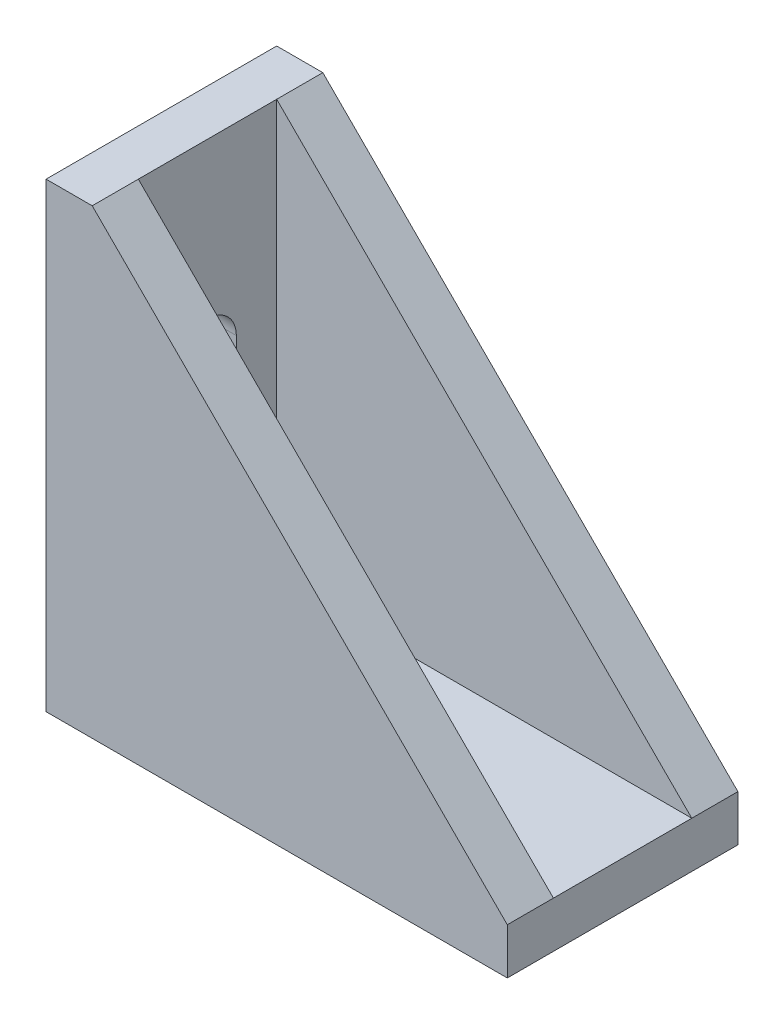
ISO-10303-21;
HEADER;
FILE_DESCRIPTION(('STEP AP214'),'2;1');
FILE_NAME('part.step','',(''),(''),'','','');
FILE_SCHEMA(('AUTOMOTIVE_DESIGN { 1 0 10303 214 1 1 1 1 }'));
ENDSEC;
DATA;
#1=APPLICATION_CONTEXT('core data for automotive mechanical design processes');
#2=APPLICATION_PROTOCOL_DEFINITION('international standard','automotive_design',2000,#1);
#3=PRODUCT_CONTEXT('',#1,'mechanical');
#4=PRODUCT('Part','Part','',(#3));
#5=PRODUCT_RELATED_PRODUCT_CATEGORY('part','',(#4));
#6=PRODUCT_DEFINITION_FORMATION('','',#4);
#7=PRODUCT_DEFINITION_CONTEXT('part definition',#1,'design');
#8=PRODUCT_DEFINITION('design','',#6,#7);
#9=PRODUCT_DEFINITION_SHAPE('','',#8);
#10=(LENGTH_UNIT() NAMED_UNIT(*) SI_UNIT(.MILLI.,.METRE.));
#11=(NAMED_UNIT(*) PLANE_ANGLE_UNIT() SI_UNIT($,.RADIAN.));
#12=(NAMED_UNIT(*) SI_UNIT($,.STERADIAN.) SOLID_ANGLE_UNIT());
#13=UNCERTAINTY_MEASURE_WITH_UNIT(LENGTH_MEASURE(1.E-05),#10,'distance_accuracy_value','');
#14=(GEOMETRIC_REPRESENTATION_CONTEXT(3) GLOBAL_UNCERTAINTY_ASSIGNED_CONTEXT((#13)) GLOBAL_UNIT_ASSIGNED_CONTEXT((#10,
#11,#12)) REPRESENTATION_CONTEXT('',''));
#15=CARTESIAN_POINT('',(0.,0.,0.));
#16=DIRECTION('',(0.,0.,1.));
#17=DIRECTION('',(1.,0.,0.));
#18=AXIS2_PLACEMENT_3D('',#15,#16,#17);
#19=CARTESIAN_POINT('',(20.,4.,-10.));
#20=DIRECTION('',(-1.,0.,0.));
#21=DIRECTION('',(0.,0.,1.));
#22=AXIS2_PLACEMENT_3D('',#19,#20,#21);
#23=PLANE('',#22);
#24=DIRECTION('',(0.,0.,-1.));
#25=VECTOR('',#24,1.);
#26=CARTESIAN_POINT('',(20.,0.,-10.));
#27=LINE('',#26,#25);
#28=CARTESIAN_POINT('',(20.,0.,10.));
#29=VERTEX_POINT('',#28);
#30=CARTESIAN_POINT('',(20.,0.,-10.));
#31=VERTEX_POINT('',#30);
#32=EDGE_CURVE('E253',#29,#31,#27,.T.);
#33=ORIENTED_EDGE('',*,*,#32,.T.);
#34=DIRECTION('',(0.,-1.,0.));
#35=VECTOR('',#34,1.);
#36=CARTESIAN_POINT('',(20.,4.,-10.));
#37=LINE('',#36,#35);
#38=CARTESIAN_POINT('',(20.,4.,-10.));
#39=VERTEX_POINT('',#38);
#40=EDGE_CURVE('E273',#39,#31,#37,.T.);
#41=ORIENTED_EDGE('',*,*,#40,.F.);
#42=DIRECTION('',(0.,0.,-1.));
#43=VECTOR('',#42,1.);
#44=CARTESIAN_POINT('',(20.,4.,-6.));
#45=LINE('',#44,#43);
#46=CARTESIAN_POINT('',(20.,4.,-6.));
#47=VERTEX_POINT('',#46);
#48=EDGE_CURVE('E225',#47,#39,#45,.T.);
#49=ORIENTED_EDGE('',*,*,#48,.F.);
#50=DIRECTION('',(0.,0.,-1.));
#51=VECTOR('',#50,1.);
#52=CARTESIAN_POINT('',(20.,4.,-10.));
#53=LINE('',#52,#51);
#54=CARTESIAN_POINT('',(20.,4.,6.));
#55=VERTEX_POINT('',#54);
#56=EDGE_CURVE('E257',#55,#47,#53,.T.);
#57=ORIENTED_EDGE('',*,*,#56,.F.);
#58=CARTESIAN_POINT('',(20.,4.,10.));
#59=VERTEX_POINT('',#58);
#60=EDGE_CURVE('E254',#59,#55,#53,.T.);
#61=ORIENTED_EDGE('',*,*,#60,.F.);
#62=DIRECTION('',(0.,-1.,0.));
#63=VECTOR('',#62,1.);
#64=CARTESIAN_POINT('',(20.,4.,10.));
#65=LINE('',#64,#63);
#66=EDGE_CURVE('E256',#59,#29,#65,.T.);
#67=ORIENTED_EDGE('',*,*,#66,.T.);
#68=EDGE_LOOP('',(#33,#41,#49,#57,#61,#67));
#69=FACE_BOUND('',#68,.T.);
#70=ADVANCED_FACE('F41',(#69),#23,.F.);
#71=CARTESIAN_POINT('',(-20.,4.,-10.));
#72=DIRECTION('',(0.,0.,1.));
#73=DIRECTION('',(1.,0.,0.));
#74=AXIS2_PLACEMENT_3D('',#71,#72,#73);
#75=PLANE('',#74);
#76=DIRECTION('',(-1.,0.,0.));
#77=VECTOR('',#76,1.);
#78=CARTESIAN_POINT('',(-20.,0.,-10.));
#79=LINE('',#78,#77);
#80=CARTESIAN_POINT('',(-20.,0.,-10.));
#81=VERTEX_POINT('',#80);
#82=EDGE_CURVE('E259',#31,#81,#79,.T.);
#83=ORIENTED_EDGE('',*,*,#82,.T.);
#84=DIRECTION('',(0.,-1.,0.));
#85=VECTOR('',#84,1.);
#86=CARTESIAN_POINT('',(-20.,4.,-10.));
#87=LINE('',#86,#85);
#88=CARTESIAN_POINT('',(-20.,40.,-10.));
#89=VERTEX_POINT('',#88);
#90=EDGE_CURVE('E270',#89,#81,#87,.T.);
#91=ORIENTED_EDGE('',*,*,#90,.F.);
#92=DIRECTION('',(-1.,0.,0.));
#93=VECTOR('',#92,1.);
#94=CARTESIAN_POINT('',(-16.,40.,-10.));
#95=LINE('',#94,#93);
#96=CARTESIAN_POINT('',(-16.,40.,-10.));
#97=VERTEX_POINT('',#96);
#98=EDGE_CURVE('E245',#97,#89,#95,.T.);
#99=ORIENTED_EDGE('',*,*,#98,.F.);
#100=DIRECTION('',(-0.707106781186547,0.707106781186547,0.));
#101=VECTOR('',#100,1.);
#102=CARTESIAN_POINT('',(-16.,40.,-10.));
#103=LINE('',#102,#101);
#104=EDGE_CURVE('E214',#39,#97,#103,.T.);
#105=ORIENTED_EDGE('',*,*,#104,.F.);
#106=ORIENTED_EDGE('',*,*,#40,.T.);
#107=EDGE_LOOP('',(#83,#91,#99,#105,#106));
#108=FACE_BOUND('',#107,.T.);
#109=ADVANCED_FACE('F317',(#108),#75,.F.);
#110=CARTESIAN_POINT('',(-20.,4.,-10.));
#111=DIRECTION('',(1.,0.,0.));
#112=DIRECTION('',(0.,0.,-1.));
#113=AXIS2_PLACEMENT_3D('',#110,#111,#112);
#114=PLANE('',#113);
#115=DIRECTION('',(0.,1.,0.));
#116=VECTOR('',#115,1.);
#117=CARTESIAN_POINT('',(-20.,24.,-2.5));
#118=LINE('',#117,#116);
#119=CARTESIAN_POINT('',(-20.,20.,-2.5));
#120=VERTEX_POINT('',#119);
#121=CARTESIAN_POINT('',(-20.,24.,-2.5));
#122=VERTEX_POINT('',#121);
#123=EDGE_CURVE('E160',#120,#122,#118,.T.);
#124=ORIENTED_EDGE('',*,*,#123,.T.);
#125=CARTESIAN_POINT('',(-20.,24.,0.));
#126=DIRECTION('',(1.,0.,0.));
#127=DIRECTION('',(0.,0.,-1.));
#128=AXIS2_PLACEMENT_3D('',#125,#126,#127);
#129=CIRCLE('',#128,2.5);
#130=CARTESIAN_POINT('',(-20.,24.,2.5));
#131=VERTEX_POINT('',#130);
#132=EDGE_CURVE('E154',#122,#131,#129,.T.);
#133=ORIENTED_EDGE('',*,*,#132,.T.);
#134=DIRECTION('',(0.,-1.,0.));
#135=VECTOR('',#134,1.);
#136=CARTESIAN_POINT('',(-20.,24.,2.5));
#137=LINE('',#136,#135);
#138=CARTESIAN_POINT('',(-20.,20.,2.5));
#139=VERTEX_POINT('',#138);
#140=EDGE_CURVE('E163',#131,#139,#137,.T.);
#141=ORIENTED_EDGE('',*,*,#140,.T.);
#142=CARTESIAN_POINT('',(-20.,20.,0.));
#143=DIRECTION('',(1.,0.,0.));
#144=DIRECTION('',(0.,0.,-1.));
#145=AXIS2_PLACEMENT_3D('',#142,#143,#144);
#146=CIRCLE('',#145,2.5);
#147=EDGE_CURVE('E55',#139,#120,#146,.T.);
#148=ORIENTED_EDGE('',*,*,#147,.T.);
#149=EDGE_LOOP('',(#124,#133,#141,#148));
#150=FACE_BOUND('',#149,.T.);
#151=DIRECTION('',(0.,0.,-1.));
#152=VECTOR('',#151,1.);
#153=CARTESIAN_POINT('',(-20.,40.,-10.));
#154=LINE('',#153,#152);
#155=CARTESIAN_POINT('',(-20.,40.,10.));
#156=VERTEX_POINT('',#155);
#157=EDGE_CURVE('E238',#156,#89,#154,.T.);
#158=ORIENTED_EDGE('',*,*,#157,.T.);
#159=ORIENTED_EDGE('',*,*,#90,.T.);
#160=DIRECTION('',(0.,0.,1.));
#161=VECTOR('',#160,1.);
#162=CARTESIAN_POINT('',(-20.,0.,-10.));
#163=LINE('',#162,#161);
#164=CARTESIAN_POINT('',(-20.,0.,10.));
#165=VERTEX_POINT('',#164);
#166=EDGE_CURVE('E261',#81,#165,#163,.T.);
#167=ORIENTED_EDGE('',*,*,#166,.T.);
#168=DIRECTION('',(0.,-1.,0.));
#169=VECTOR('',#168,1.);
#170=CARTESIAN_POINT('',(-20.,4.,10.));
#171=LINE('',#170,#169);
#172=EDGE_CURVE('E267',#156,#165,#171,.T.);
#173=ORIENTED_EDGE('',*,*,#172,.F.);
#174=EDGE_LOOP('',(#158,#159,#167,#173));
#175=FACE_BOUND('',#174,.T.);
#176=ADVANCED_FACE('F167',(#150,#175),#114,.F.);
#177=CARTESIAN_POINT('',(-20.,4.,10.));
#178=DIRECTION('',(0.,0.,-1.));
#179=DIRECTION('',(-1.,0.,0.));
#180=AXIS2_PLACEMENT_3D('',#177,#178,#179);
#181=PLANE('',#180);
#182=ORIENTED_EDGE('',*,*,#66,.F.);
#183=DIRECTION('',(-0.707106781186547,0.707106781186547,0.));
#184=VECTOR('',#183,1.);
#185=CARTESIAN_POINT('',(-16.,40.,10.));
#186=LINE('',#185,#184);
#187=CARTESIAN_POINT('',(-16.,40.,10.));
#188=VERTEX_POINT('',#187);
#189=EDGE_CURVE('E231',#59,#188,#186,.T.);
#190=ORIENTED_EDGE('',*,*,#189,.T.);
#191=DIRECTION('',(-1.,0.,0.));
#192=VECTOR('',#191,1.);
#193=CARTESIAN_POINT('',(-16.,40.,10.));
#194=LINE('',#193,#192);
#195=EDGE_CURVE('E242',#188,#156,#194,.T.);
#196=ORIENTED_EDGE('',*,*,#195,.T.);
#197=ORIENTED_EDGE('',*,*,#172,.T.);
#198=DIRECTION('',(1.,0.,0.));
#199=VECTOR('',#198,1.);
#200=CARTESIAN_POINT('',(-20.,0.,10.));
#201=LINE('',#200,#199);
#202=EDGE_CURVE('E263',#165,#29,#201,.T.);
#203=ORIENTED_EDGE('',*,*,#202,.T.);
#204=EDGE_LOOP('',(#182,#190,#196,#197,#203));
#205=FACE_BOUND('',#204,.T.);
#206=ADVANCED_FACE('F296',(#205),#181,.F.);
#207=CARTESIAN_POINT('',(0.,4.,0.));
#208=DIRECTION('',(0.,1.,0.));
#209=DIRECTION('',(0.,0.,1.));
#210=AXIS2_PLACEMENT_3D('',#207,#208,#209);
#211=PLANE('',#210);
#212=CARTESIAN_POINT('',(-2.,4.,0.));
#213=DIRECTION('',(0.,1.,0.));
#214=DIRECTION('',(0.,0.,1.));
#215=AXIS2_PLACEMENT_3D('',#212,#213,#214);
#216=CIRCLE('',#215,2.5);
#217=CARTESIAN_POINT('',(-2.,4.,-2.5));
#218=VERTEX_POINT('',#217);
#219=CARTESIAN_POINT('',(-2.,4.,2.5));
#220=VERTEX_POINT('',#219);
#221=EDGE_CURVE('E185',#218,#220,#216,.T.);
#222=ORIENTED_EDGE('',*,*,#221,.F.);
#223=DIRECTION('',(-1.,0.,0.));
#224=VECTOR('',#223,1.);
#225=CARTESIAN_POINT('',(-2.,4.,-2.5));
#226=LINE('',#225,#224);
#227=CARTESIAN_POINT('',(2.,4.,-2.5));
#228=VERTEX_POINT('',#227);
#229=EDGE_CURVE('E193',#228,#218,#226,.T.);
#230=ORIENTED_EDGE('',*,*,#229,.F.);
#231=CARTESIAN_POINT('',(2.,4.,0.));
#232=DIRECTION('',(0.,1.,0.));
#233=DIRECTION('',(0.,0.,1.));
#234=AXIS2_PLACEMENT_3D('',#231,#232,#233);
#235=CIRCLE('',#234,2.5);
#236=CARTESIAN_POINT('',(2.,4.,2.5));
#237=VERTEX_POINT('',#236);
#238=EDGE_CURVE('E207',#237,#228,#235,.T.);
#239=ORIENTED_EDGE('',*,*,#238,.F.);
#240=DIRECTION('',(1.,0.,0.));
#241=VECTOR('',#240,1.);
#242=CARTESIAN_POINT('',(-2.,4.,2.5));
#243=LINE('',#242,#241);
#244=EDGE_CURVE('E204',#220,#237,#243,.T.);
#245=ORIENTED_EDGE('',*,*,#244,.F.);
#246=EDGE_LOOP('',(#222,#230,#239,#245));
#247=FACE_BOUND('',#246,.T.);
#248=DIRECTION('',(1.,0.,0.));
#249=VECTOR('',#248,1.);
#250=CARTESIAN_POINT('',(0.,4.,-6.));
#251=LINE('',#250,#249);
#252=CARTESIAN_POINT('',(-16.,4.,-6.));
#253=VERTEX_POINT('',#252);
#254=EDGE_CURVE('E227',#253,#47,#251,.T.);
#255=ORIENTED_EDGE('',*,*,#254,.F.);
#256=DIRECTION('',(0.,0.,-1.));
#257=VECTOR('',#256,1.);
#258=CARTESIAN_POINT('',(-16.,4.,0.));
#259=LINE('',#258,#257);
#260=CARTESIAN_POINT('',(-16.,4.,6.));
#261=VERTEX_POINT('',#260);
#262=EDGE_CURVE('E248',#261,#253,#259,.T.);
#263=ORIENTED_EDGE('',*,*,#262,.F.);
#264=DIRECTION('',(-1.,0.,0.));
#265=VECTOR('',#264,1.);
#266=CARTESIAN_POINT('',(0.,4.,6.));
#267=LINE('',#266,#265);
#268=EDGE_CURVE('E235',#55,#261,#267,.T.);
#269=ORIENTED_EDGE('',*,*,#268,.F.);
#270=ORIENTED_EDGE('',*,*,#56,.T.);
#271=EDGE_LOOP('',(#255,#263,#269,#270));
#272=FACE_BOUND('',#271,.T.);
#273=ADVANCED_FACE('F306',(#247,#272),#211,.T.);
#274=CARTESIAN_POINT('',(0.,0.,0.));
#275=DIRECTION('',(0.,1.,0.));
#276=DIRECTION('',(0.,0.,1.));
#277=AXIS2_PLACEMENT_3D('',#274,#275,#276);
#278=PLANE('',#277);
#279=DIRECTION('',(-1.,0.,0.));
#280=VECTOR('',#279,1.);
#281=CARTESIAN_POINT('',(-2.,0.,-2.5));
#282=LINE('',#281,#280);
#283=CARTESIAN_POINT('',(2.,0.,-2.5));
#284=VERTEX_POINT('',#283);
#285=CARTESIAN_POINT('',(-2.,0.,-2.5));
#286=VERTEX_POINT('',#285);
#287=EDGE_CURVE('E199',#284,#286,#282,.T.);
#288=ORIENTED_EDGE('',*,*,#287,.T.);
#289=CARTESIAN_POINT('',(-2.,0.,0.));
#290=DIRECTION('',(0.,1.,0.));
#291=DIRECTION('',(0.,0.,1.));
#292=AXIS2_PLACEMENT_3D('',#289,#290,#291);
#293=CIRCLE('',#292,2.5);
#294=CARTESIAN_POINT('',(-2.,0.,2.5));
#295=VERTEX_POINT('',#294);
#296=EDGE_CURVE('E189',#286,#295,#293,.T.);
#297=ORIENTED_EDGE('',*,*,#296,.T.);
#298=DIRECTION('',(1.,0.,0.));
#299=VECTOR('',#298,1.);
#300=CARTESIAN_POINT('',(-2.,0.,2.5));
#301=LINE('',#300,#299);
#302=CARTESIAN_POINT('',(2.,0.,2.5));
#303=VERTEX_POINT('',#302);
#304=EDGE_CURVE('E192',#295,#303,#301,.T.);
#305=ORIENTED_EDGE('',*,*,#304,.T.);
#306=CARTESIAN_POINT('',(2.,0.,0.));
#307=DIRECTION('',(0.,1.,0.));
#308=DIRECTION('',(0.,0.,1.));
#309=AXIS2_PLACEMENT_3D('',#306,#307,#308);
#310=CIRCLE('',#309,2.5);
#311=EDGE_CURVE('E196',#303,#284,#310,.T.);
#312=ORIENTED_EDGE('',*,*,#311,.T.);
#313=EDGE_LOOP('',(#288,#297,#305,#312));
#314=FACE_BOUND('',#313,.T.);
#315=ORIENTED_EDGE('',*,*,#202,.F.);
#316=ORIENTED_EDGE('',*,*,#166,.F.);
#317=ORIENTED_EDGE('',*,*,#82,.F.);
#318=ORIENTED_EDGE('',*,*,#32,.F.);
#319=EDGE_LOOP('',(#315,#316,#317,#318));
#320=FACE_BOUND('',#319,.T.);
#321=ADVANCED_FACE('F321',(#314,#320),#278,.F.);
#322=CARTESIAN_POINT('',(-16.,40.,-10.));
#323=DIRECTION('',(0.,1.,0.));
#324=DIRECTION('',(0.,0.,1.));
#325=AXIS2_PLACEMENT_3D('',#322,#323,#324);
#326=PLANE('',#325);
#327=DIRECTION('',(0.,0.,-1.));
#328=VECTOR('',#327,1.);
#329=CARTESIAN_POINT('',(-16.,40.,-10.));
#330=LINE('',#329,#328);
#331=CARTESIAN_POINT('',(-16.,40.,6.));
#332=VERTEX_POINT('',#331);
#333=CARTESIAN_POINT('',(-16.,40.,-6.));
#334=VERTEX_POINT('',#333);
#335=EDGE_CURVE('E243',#332,#334,#330,.T.);
#336=ORIENTED_EDGE('',*,*,#335,.T.);
#337=DIRECTION('',(0.,0.,-1.));
#338=VECTOR('',#337,1.);
#339=CARTESIAN_POINT('',(-16.,40.,-6.));
#340=LINE('',#339,#338);
#341=EDGE_CURVE('E223',#334,#97,#340,.T.);
#342=ORIENTED_EDGE('',*,*,#341,.T.);
#343=ORIENTED_EDGE('',*,*,#98,.T.);
#344=ORIENTED_EDGE('',*,*,#157,.F.);
#345=ORIENTED_EDGE('',*,*,#195,.F.);
#346=EDGE_CURVE('E239',#188,#332,#330,.T.);
#347=ORIENTED_EDGE('',*,*,#346,.T.);
#348=EDGE_LOOP('',(#336,#342,#343,#344,#345,#347));
#349=FACE_BOUND('',#348,.T.);
#350=ADVANCED_FACE('F292',(#349),#326,.T.);
#351=CARTESIAN_POINT('',(-16.,0.,0.));
#352=DIRECTION('',(1.,0.,0.));
#353=DIRECTION('',(0.,0.,-1.));
#354=AXIS2_PLACEMENT_3D('',#351,#352,#353);
#355=PLANE('',#354);
#356=CARTESIAN_POINT('',(-16.,24.,0.));
#357=DIRECTION('',(1.,0.,0.));
#358=DIRECTION('',(0.,0.,-1.));
#359=AXIS2_PLACEMENT_3D('',#356,#357,#358);
#360=CIRCLE('',#359,2.5);
#361=CARTESIAN_POINT('',(-16.,24.,-2.5));
#362=VERTEX_POINT('',#361);
#363=CARTESIAN_POINT('',(-16.,24.,2.5));
#364=VERTEX_POINT('',#363);
#365=EDGE_CURVE('E63',#362,#364,#360,.T.);
#366=ORIENTED_EDGE('',*,*,#365,.F.);
#367=DIRECTION('',(0.,1.,0.));
#368=VECTOR('',#367,1.);
#369=CARTESIAN_POINT('',(-16.,24.,-2.5));
#370=LINE('',#369,#368);
#371=CARTESIAN_POINT('',(-16.,20.,-2.5));
#372=VERTEX_POINT('',#371);
#373=EDGE_CURVE('E170',#372,#362,#370,.T.);
#374=ORIENTED_EDGE('',*,*,#373,.F.);
#375=CARTESIAN_POINT('',(-16.,20.,0.));
#376=DIRECTION('',(1.,0.,0.));
#377=DIRECTION('',(0.,0.,-1.));
#378=AXIS2_PLACEMENT_3D('',#375,#376,#377);
#379=CIRCLE('',#378,2.5);
#380=CARTESIAN_POINT('',(-16.,20.,2.5));
#381=VERTEX_POINT('',#380);
#382=EDGE_CURVE('E173',#381,#372,#379,.T.);
#383=ORIENTED_EDGE('',*,*,#382,.F.);
#384=DIRECTION('',(0.,-1.,0.));
#385=VECTOR('',#384,1.);
#386=CARTESIAN_POINT('',(-16.,24.,2.5));
#387=LINE('',#386,#385);
#388=EDGE_CURVE('E179',#364,#381,#387,.T.);
#389=ORIENTED_EDGE('',*,*,#388,.F.);
#390=EDGE_LOOP('',(#366,#374,#383,#389));
#391=FACE_BOUND('',#390,.T.);
#392=DIRECTION('',(0.,-1.,0.));
#393=VECTOR('',#392,1.);
#394=CARTESIAN_POINT('',(-16.,0.,-6.));
#395=LINE('',#394,#393);
#396=EDGE_CURVE('E11',#334,#253,#395,.T.);
#397=ORIENTED_EDGE('',*,*,#396,.F.);
#398=ORIENTED_EDGE('',*,*,#335,.F.);
#399=DIRECTION('',(0.,1.,0.));
#400=VECTOR('',#399,1.);
#401=CARTESIAN_POINT('',(-16.,0.,6.));
#402=LINE('',#401,#400);
#403=EDGE_CURVE('E48',#261,#332,#402,.T.);
#404=ORIENTED_EDGE('',*,*,#403,.F.);
#405=ORIENTED_EDGE('',*,*,#262,.T.);
#406=EDGE_LOOP('',(#397,#398,#404,#405));
#407=FACE_BOUND('',#406,.T.);
#408=ADVANCED_FACE('F290',(#391,#407),#355,.T.);
#409=CARTESIAN_POINT('',(-16.,40.,6.));
#410=DIRECTION('',(0.707106781186547,0.707106781186547,0.));
#411=DIRECTION('',(-0.707106781186548,0.707106781186548,0.));
#412=AXIS2_PLACEMENT_3D('',#409,#410,#411);
#413=PLANE('',#412);
#414=ORIENTED_EDGE('',*,*,#189,.F.);
#415=ORIENTED_EDGE('',*,*,#60,.T.);
#416=DIRECTION('',(-0.707106781186547,0.707106781186547,0.));
#417=VECTOR('',#416,1.);
#418=CARTESIAN_POINT('',(-16.,40.,6.));
#419=LINE('',#418,#417);
#420=EDGE_CURVE('E232',#55,#332,#419,.T.);
#421=ORIENTED_EDGE('',*,*,#420,.T.);
#422=ORIENTED_EDGE('',*,*,#346,.F.);
#423=EDGE_LOOP('',(#414,#415,#421,#422));
#424=FACE_BOUND('',#423,.T.);
#425=ADVANCED_FACE('F285',(#424),#413,.T.);
#426=CARTESIAN_POINT('',(0.,0.,6.));
#427=DIRECTION('',(0.,0.,-1.));
#428=DIRECTION('',(-1.,0.,0.));
#429=AXIS2_PLACEMENT_3D('',#426,#427,#428);
#430=PLANE('',#429);
#431=ORIENTED_EDGE('',*,*,#420,.F.);
#432=ORIENTED_EDGE('',*,*,#268,.T.);
#433=ORIENTED_EDGE('',*,*,#403,.T.);
#434=EDGE_LOOP('',(#431,#432,#433));
#435=FACE_BOUND('',#434,.T.);
#436=ADVANCED_FACE('F278',(#435),#430,.T.);
#437=CARTESIAN_POINT('',(-16.,40.,-6.));
#438=DIRECTION('',(-0.707106781186547,-0.707106781186547,0.));
#439=DIRECTION('',(0.707106781186548,-0.707106781186548,0.));
#440=AXIS2_PLACEMENT_3D('',#437,#438,#439);
#441=PLANE('',#440);
#442=ORIENTED_EDGE('',*,*,#104,.T.);
#443=ORIENTED_EDGE('',*,*,#341,.F.);
#444=DIRECTION('',(-0.707106781186547,0.707106781186547,0.));
#445=VECTOR('',#444,1.);
#446=CARTESIAN_POINT('',(-16.,40.,-6.));
#447=LINE('',#446,#445);
#448=EDGE_CURVE('E221',#47,#334,#447,.T.);
#449=ORIENTED_EDGE('',*,*,#448,.F.);
#450=ORIENTED_EDGE('',*,*,#48,.T.);
#451=EDGE_LOOP('',(#442,#443,#449,#450));
#452=FACE_BOUND('',#451,.T.);
#453=ADVANCED_FACE('F312',(#452),#441,.F.);
#454=CARTESIAN_POINT('',(0.,0.,-6.));
#455=DIRECTION('',(0.,0.,1.));
#456=DIRECTION('',(-1.,0.,0.));
#457=AXIS2_PLACEMENT_3D('',#454,#455,#456);
#458=PLANE('',#457);
#459=ORIENTED_EDGE('',*,*,#396,.T.);
#460=ORIENTED_EDGE('',*,*,#254,.T.);
#461=ORIENTED_EDGE('',*,*,#448,.T.);
#462=EDGE_LOOP('',(#459,#460,#461));
#463=FACE_BOUND('',#462,.T.);
#464=ADVANCED_FACE('F309',(#463),#458,.T.);
#465=CARTESIAN_POINT('',(-2.,0.,0.));
#466=DIRECTION('',(0.,1.,0.));
#467=DIRECTION('',(0.,0.,1.));
#468=AXIS2_PLACEMENT_3D('',#465,#466,#467);
#469=CYLINDRICAL_SURFACE('',#468,2.5);
#470=ORIENTED_EDGE('',*,*,#221,.T.);
#471=DIRECTION('',(0.,1.,0.));
#472=VECTOR('',#471,1.);
#473=CARTESIAN_POINT('',(-2.,0.,2.5));
#474=LINE('',#473,#472);
#475=EDGE_CURVE('E202',#295,#220,#474,.T.);
#476=ORIENTED_EDGE('',*,*,#475,.F.);
#477=ORIENTED_EDGE('',*,*,#296,.F.);
#478=DIRECTION('',(0.,1.,0.));
#479=VECTOR('',#478,1.);
#480=CARTESIAN_POINT('',(-2.,0.,-2.5));
#481=LINE('',#480,#479);
#482=EDGE_CURVE('E212',#286,#218,#481,.T.);
#483=ORIENTED_EDGE('',*,*,#482,.T.);
#484=EDGE_LOOP('',(#470,#476,#477,#483));
#485=FACE_BOUND('',#484,.T.);
#486=ADVANCED_FACE('F385',(#485),#469,.F.);
#487=CARTESIAN_POINT('',(-2.,0.,-2.5));
#488=DIRECTION('',(0.,0.,-1.));
#489=DIRECTION('',(-1.,0.,0.));
#490=AXIS2_PLACEMENT_3D('',#487,#488,#489);
#491=PLANE('',#490);
#492=ORIENTED_EDGE('',*,*,#229,.T.);
#493=ORIENTED_EDGE('',*,*,#482,.F.);
#494=ORIENTED_EDGE('',*,*,#287,.F.);
#495=DIRECTION('',(0.,1.,0.));
#496=VECTOR('',#495,1.);
#497=CARTESIAN_POINT('',(2.,0.,-2.5));
#498=LINE('',#497,#496);
#499=EDGE_CURVE('E215',#284,#228,#498,.T.);
#500=ORIENTED_EDGE('',*,*,#499,.T.);
#501=EDGE_LOOP('',(#492,#493,#494,#500));
#502=FACE_BOUND('',#501,.T.);
#503=ADVANCED_FACE('F393',(#502),#491,.F.);
#504=CARTESIAN_POINT('',(2.,0.,0.));
#505=DIRECTION('',(0.,1.,0.));
#506=DIRECTION('',(0.,0.,1.));
#507=AXIS2_PLACEMENT_3D('',#504,#505,#506);
#508=CYLINDRICAL_SURFACE('',#507,2.5);
#509=ORIENTED_EDGE('',*,*,#238,.T.);
#510=ORIENTED_EDGE('',*,*,#499,.F.);
#511=ORIENTED_EDGE('',*,*,#311,.F.);
#512=DIRECTION('',(0.,1.,0.));
#513=VECTOR('',#512,1.);
#514=CARTESIAN_POINT('',(2.,0.,2.5));
#515=LINE('',#514,#513);
#516=EDGE_CURVE('E217',#303,#237,#515,.T.);
#517=ORIENTED_EDGE('',*,*,#516,.T.);
#518=EDGE_LOOP('',(#509,#510,#511,#517));
#519=FACE_BOUND('',#518,.T.);
#520=ADVANCED_FACE('F403',(#519),#508,.F.);
#521=CARTESIAN_POINT('',(-2.,0.,2.5));
#522=DIRECTION('',(0.,0.,1.));
#523=DIRECTION('',(1.,0.,0.));
#524=AXIS2_PLACEMENT_3D('',#521,#522,#523);
#525=PLANE('',#524);
#526=ORIENTED_EDGE('',*,*,#244,.T.);
#527=ORIENTED_EDGE('',*,*,#516,.F.);
#528=ORIENTED_EDGE('',*,*,#304,.F.);
#529=ORIENTED_EDGE('',*,*,#475,.T.);
#530=EDGE_LOOP('',(#526,#527,#528,#529));
#531=FACE_BOUND('',#530,.T.);
#532=ADVANCED_FACE('F413',(#531),#525,.F.);
#533=CARTESIAN_POINT('',(-20.,24.,0.));
#534=DIRECTION('',(1.,0.,0.));
#535=DIRECTION('',(0.,0.,-1.));
#536=AXIS2_PLACEMENT_3D('',#533,#534,#535);
#537=CYLINDRICAL_SURFACE('',#536,2.5);
#538=ORIENTED_EDGE('',*,*,#365,.T.);
#539=DIRECTION('',(1.,0.,0.));
#540=VECTOR('',#539,1.);
#541=CARTESIAN_POINT('',(-20.,24.,2.5));
#542=LINE('',#541,#540);
#543=EDGE_CURVE('E150',#131,#364,#542,.T.);
#544=ORIENTED_EDGE('',*,*,#543,.F.);
#545=ORIENTED_EDGE('',*,*,#132,.F.);
#546=DIRECTION('',(1.,0.,0.));
#547=VECTOR('',#546,1.);
#548=CARTESIAN_POINT('',(-20.,24.,-2.5));
#549=LINE('',#548,#547);
#550=EDGE_CURVE('E183',#122,#362,#549,.T.);
#551=ORIENTED_EDGE('',*,*,#550,.T.);
#552=EDGE_LOOP('',(#538,#544,#545,#551));
#553=FACE_BOUND('',#552,.T.);
#554=ADVANCED_FACE('F152',(#553),#537,.F.);
#555=CARTESIAN_POINT('',(-20.,24.,-2.5));
#556=DIRECTION('',(0.,0.,-1.));
#557=DIRECTION('',(-1.,0.,0.));
#558=AXIS2_PLACEMENT_3D('',#555,#556,#557);
#559=PLANE('',#558);
#560=ORIENTED_EDGE('',*,*,#373,.T.);
#561=ORIENTED_EDGE('',*,*,#550,.F.);
#562=ORIENTED_EDGE('',*,*,#123,.F.);
#563=DIRECTION('',(1.,0.,0.));
#564=VECTOR('',#563,1.);
#565=CARTESIAN_POINT('',(-20.,20.,-2.5));
#566=LINE('',#565,#564);
#567=EDGE_CURVE('E186',#120,#372,#566,.T.);
#568=ORIENTED_EDGE('',*,*,#567,.T.);
#569=EDGE_LOOP('',(#560,#561,#562,#568));
#570=FACE_BOUND('',#569,.T.);
#571=ADVANCED_FACE('F432',(#570),#559,.F.);
#572=CARTESIAN_POINT('',(-20.,20.,0.));
#573=DIRECTION('',(1.,0.,0.));
#574=DIRECTION('',(0.,0.,-1.));
#575=AXIS2_PLACEMENT_3D('',#572,#573,#574);
#576=CYLINDRICAL_SURFACE('',#575,2.5);
#577=ORIENTED_EDGE('',*,*,#382,.T.);
#578=ORIENTED_EDGE('',*,*,#567,.F.);
#579=ORIENTED_EDGE('',*,*,#147,.F.);
#580=DIRECTION('',(1.,0.,0.));
#581=VECTOR('',#580,1.);
#582=CARTESIAN_POINT('',(-20.,20.,2.5));
#583=LINE('',#582,#581);
#584=EDGE_CURVE('E159',#139,#381,#583,.T.);
#585=ORIENTED_EDGE('',*,*,#584,.T.);
#586=EDGE_LOOP('',(#577,#578,#579,#585));
#587=FACE_BOUND('',#586,.T.);
#588=ADVANCED_FACE('F442',(#587),#576,.F.);
#589=CARTESIAN_POINT('',(-20.,24.,2.5));
#590=DIRECTION('',(0.,0.,1.));
#591=DIRECTION('',(1.,0.,0.));
#592=AXIS2_PLACEMENT_3D('',#589,#590,#591);
#593=PLANE('',#592);
#594=ORIENTED_EDGE('',*,*,#388,.T.);
#595=ORIENTED_EDGE('',*,*,#584,.F.);
#596=ORIENTED_EDGE('',*,*,#140,.F.);
#597=ORIENTED_EDGE('',*,*,#543,.T.);
#598=EDGE_LOOP('',(#594,#595,#596,#597));
#599=FACE_BOUND('',#598,.T.);
#600=ADVANCED_FACE('F164',(#599),#593,.F.);
#601=CLOSED_SHELL('',(#70,#109,#176,#206,#273,#321,#350,#408,#425,#436,#453,#464,#486,#503,#520,
#532,#554,#571,#588,#600));
#602=MANIFOLD_SOLID_BREP('B2',#601);
#603=ADVANCED_BREP_SHAPE_REPRESENTATION('',(#18,#602),#14);
#604=SHAPE_DEFINITION_REPRESENTATION(#9,#603);
ENDSEC;
END-ISO-10303-21;
